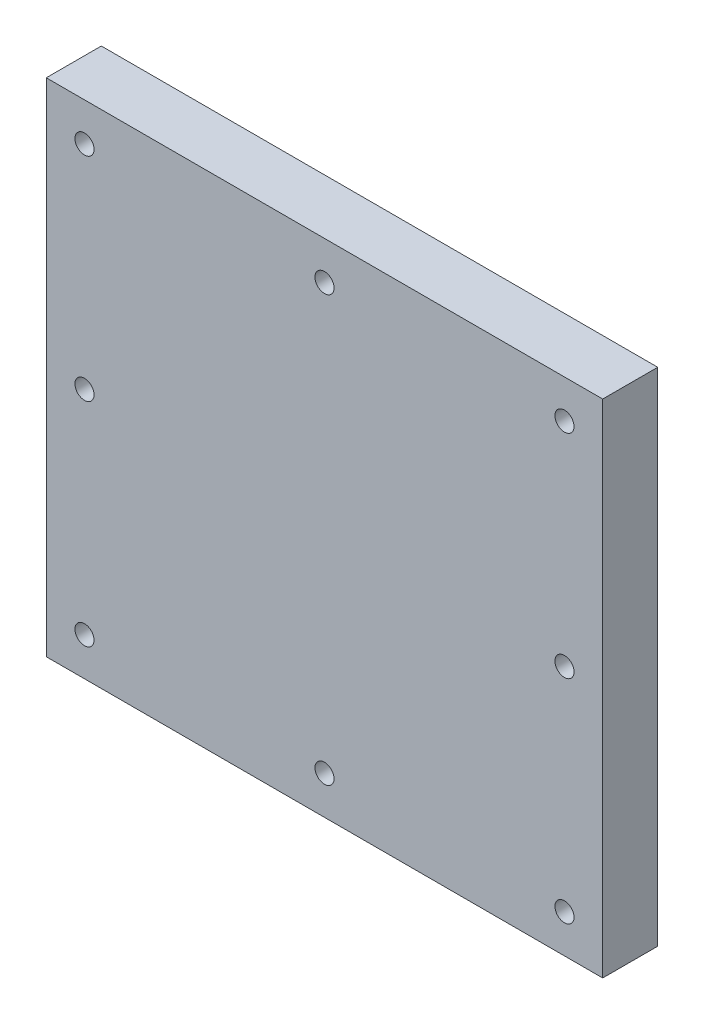
ISO-10303-21;
HEADER;
FILE_DESCRIPTION(('STEP AP214'),'2;1');
FILE_NAME('part.step','',(''),(''),'','','');
FILE_SCHEMA(('AUTOMOTIVE_DESIGN { 1 0 10303 214 1 1 1 1 }'));
ENDSEC;
DATA;
#1=APPLICATION_CONTEXT('core data for automotive mechanical design processes');
#2=APPLICATION_PROTOCOL_DEFINITION('international standard','automotive_design',2000,#1);
#3=PRODUCT_CONTEXT('',#1,'mechanical');
#4=PRODUCT('Part','Part','',(#3));
#5=PRODUCT_RELATED_PRODUCT_CATEGORY('part','',(#4));
#6=PRODUCT_DEFINITION_FORMATION('','',#4);
#7=PRODUCT_DEFINITION_CONTEXT('part definition',#1,'design');
#8=PRODUCT_DEFINITION('design','',#6,#7);
#9=PRODUCT_DEFINITION_SHAPE('','',#8);
#10=(LENGTH_UNIT() NAMED_UNIT(*) SI_UNIT(.MILLI.,.METRE.));
#11=(NAMED_UNIT(*) PLANE_ANGLE_UNIT() SI_UNIT($,.RADIAN.));
#12=(NAMED_UNIT(*) SI_UNIT($,.STERADIAN.) SOLID_ANGLE_UNIT());
#13=UNCERTAINTY_MEASURE_WITH_UNIT(LENGTH_MEASURE(1.E-05),#10,'distance_accuracy_value','');
#14=(GEOMETRIC_REPRESENTATION_CONTEXT(3) GLOBAL_UNCERTAINTY_ASSIGNED_CONTEXT((#13)) GLOBAL_UNIT_ASSIGNED_CONTEXT((#10,
#11,#12)) REPRESENTATION_CONTEXT('',''));
#15=CARTESIAN_POINT('',(0.,0.,0.));
#16=DIRECTION('',(0.,0.,1.));
#17=DIRECTION('',(1.,0.,0.));
#18=AXIS2_PLACEMENT_3D('',#15,#16,#17);
#19=CARTESIAN_POINT('',(254.644886227545,234.22754491018,18.288));
#20=DIRECTION('',(1.,0.,0.));
#21=DIRECTION('',(0.,0.,-1.));
#22=AXIS2_PLACEMENT_3D('',#19,#20,#21);
#23=PLANE('',#22);
#24=DIRECTION('',(0.,-1.,0.));
#25=VECTOR('',#24,1.);
#26=CARTESIAN_POINT('',(254.644886227545,234.22754491018,0.));
#27=LINE('',#26,#25);
#28=CARTESIAN_POINT('',(254.644886227545,234.22754491018,0.));
#29=VERTEX_POINT('',#28);
#30=CARTESIAN_POINT('',(254.644886227545,67.6035449101796,0.));
#31=VERTEX_POINT('',#30);
#32=EDGE_CURVE('E110',#29,#31,#27,.T.);
#33=ORIENTED_EDGE('',*,*,#32,.T.);
#34=DIRECTION('',(0.,0.,-1.));
#35=VECTOR('',#34,1.);
#36=CARTESIAN_POINT('',(254.644886227545,67.6035449101796,18.288));
#37=LINE('',#36,#35);
#38=CARTESIAN_POINT('',(254.644886227545,67.6035449101796,18.288));
#39=VERTEX_POINT('',#38);
#40=EDGE_CURVE('E11',#39,#31,#37,.T.);
#41=ORIENTED_EDGE('',*,*,#40,.F.);
#42=DIRECTION('',(0.,-1.,0.));
#43=VECTOR('',#42,1.);
#44=CARTESIAN_POINT('',(254.644886227545,234.22754491018,18.288));
#45=LINE('',#44,#43);
#46=CARTESIAN_POINT('',(254.644886227545,234.22754491018,18.288));
#47=VERTEX_POINT('',#46);
#48=EDGE_CURVE('E93',#47,#39,#45,.T.);
#49=ORIENTED_EDGE('',*,*,#48,.F.);
#50=DIRECTION('',(0.,0.,-1.));
#51=VECTOR('',#50,1.);
#52=CARTESIAN_POINT('',(254.644886227545,234.22754491018,18.288));
#53=LINE('',#52,#51);
#54=EDGE_CURVE('E106',#47,#29,#53,.T.);
#55=ORIENTED_EDGE('',*,*,#54,.T.);
#56=EDGE_LOOP('',(#33,#41,#49,#55));
#57=FACE_BOUND('',#56,.T.);
#58=ADVANCED_FACE('F39',(#57),#23,.F.);
#59=CARTESIAN_POINT('',(254.644886227545,67.6035449101796,18.288));
#60=DIRECTION('',(0.,1.,0.));
#61=DIRECTION('',(0.,0.,1.));
#62=AXIS2_PLACEMENT_3D('',#59,#60,#61);
#63=PLANE('',#62);
#64=DIRECTION('',(1.,0.,0.));
#65=VECTOR('',#64,1.);
#66=CARTESIAN_POINT('',(254.644886227545,67.6035449101796,0.));
#67=LINE('',#66,#65);
#68=CARTESIAN_POINT('',(439.556886227545,67.6035449101796,0.));
#69=VERTEX_POINT('',#68);
#70=EDGE_CURVE('E98',#31,#69,#67,.T.);
#71=ORIENTED_EDGE('',*,*,#70,.T.);
#72=DIRECTION('',(0.,0.,-1.));
#73=VECTOR('',#72,1.);
#74=CARTESIAN_POINT('',(439.556886227545,67.6035449101796,18.288));
#75=LINE('',#74,#73);
#76=CARTESIAN_POINT('',(439.556886227545,67.6035449101796,18.288));
#77=VERTEX_POINT('',#76);
#78=EDGE_CURVE('E49',#77,#69,#75,.T.);
#79=ORIENTED_EDGE('',*,*,#78,.F.);
#80=DIRECTION('',(1.,0.,0.));
#81=VECTOR('',#80,1.);
#82=CARTESIAN_POINT('',(254.644886227545,67.6035449101796,18.288));
#83=LINE('',#82,#81);
#84=EDGE_CURVE('E88',#39,#77,#83,.T.);
#85=ORIENTED_EDGE('',*,*,#84,.F.);
#86=ORIENTED_EDGE('',*,*,#40,.T.);
#87=EDGE_LOOP('',(#71,#79,#85,#86));
#88=FACE_BOUND('',#87,.T.);
#89=ADVANCED_FACE('F97',(#88),#63,.F.);
#90=CARTESIAN_POINT('',(439.556886227545,234.22754491018,18.288));
#91=DIRECTION('',(-1.,0.,0.));
#92=DIRECTION('',(0.,-1.,0.));
#93=AXIS2_PLACEMENT_3D('',#90,#91,#92);
#94=PLANE('',#93);
#95=DIRECTION('',(0.,1.,0.));
#96=VECTOR('',#95,1.);
#97=CARTESIAN_POINT('',(439.556886227545,234.22754491018,0.));
#98=LINE('',#97,#96);
#99=CARTESIAN_POINT('',(439.556886227545,234.22754491018,0.));
#100=VERTEX_POINT('',#99);
#101=EDGE_CURVE('E75',#69,#100,#98,.T.);
#102=ORIENTED_EDGE('',*,*,#101,.T.);
#103=DIRECTION('',(0.,0.,-1.));
#104=VECTOR('',#103,1.);
#105=CARTESIAN_POINT('',(439.556886227545,234.22754491018,18.288));
#106=LINE('',#105,#104);
#107=CARTESIAN_POINT('',(439.556886227545,234.22754491018,18.288));
#108=VERTEX_POINT('',#107);
#109=EDGE_CURVE('E100',#108,#100,#106,.T.);
#110=ORIENTED_EDGE('',*,*,#109,.F.);
#111=DIRECTION('',(0.,1.,0.));
#112=VECTOR('',#111,1.);
#113=CARTESIAN_POINT('',(439.556886227545,234.22754491018,18.288));
#114=LINE('',#113,#112);
#115=EDGE_CURVE('E91',#77,#108,#114,.T.);
#116=ORIENTED_EDGE('',*,*,#115,.F.);
#117=ORIENTED_EDGE('',*,*,#78,.T.);
#118=EDGE_LOOP('',(#102,#110,#116,#117));
#119=FACE_BOUND('',#118,.T.);
#120=ADVANCED_FACE('F102',(#119),#94,.F.);
#121=CARTESIAN_POINT('',(254.644886227545,234.22754491018,18.288));
#122=DIRECTION('',(0.,-1.,0.));
#123=DIRECTION('',(0.,0.,-1.));
#124=AXIS2_PLACEMENT_3D('',#121,#122,#123);
#125=PLANE('',#124);
#126=DIRECTION('',(-1.,0.,0.));
#127=VECTOR('',#126,1.);
#128=CARTESIAN_POINT('',(254.644886227545,234.22754491018,0.));
#129=LINE('',#128,#127);
#130=EDGE_CURVE('E81',#100,#29,#129,.T.);
#131=ORIENTED_EDGE('',*,*,#130,.T.);
#132=ORIENTED_EDGE('',*,*,#54,.F.);
#133=DIRECTION('',(-1.,0.,0.));
#134=VECTOR('',#133,1.);
#135=CARTESIAN_POINT('',(254.644886227545,234.22754491018,18.288));
#136=LINE('',#135,#134);
#137=EDGE_CURVE('E58',#108,#47,#136,.T.);
#138=ORIENTED_EDGE('',*,*,#137,.F.);
#139=ORIENTED_EDGE('',*,*,#109,.T.);
#140=EDGE_LOOP('',(#131,#132,#138,#139));
#141=FACE_BOUND('',#140,.T.);
#142=ADVANCED_FACE('F188',(#141),#125,.F.);
#143=CARTESIAN_POINT('',(0.,0.,18.288));
#144=DIRECTION('',(0.,0.,1.));
#145=DIRECTION('',(1.,0.,0.));
#146=AXIS2_PLACEMENT_3D('',#143,#144,#145);
#147=PLANE('',#146);
#148=CARTESIAN_POINT('',(426.856886227545,80.3035449101796,18.288));
#149=DIRECTION('',(0.,0.,1.));
#150=DIRECTION('',(1.,0.,0.));
#151=AXIS2_PLACEMENT_3D('',#148,#149,#150);
#152=CIRCLE('',#151,3.17499999999997);
#153=CARTESIAN_POINT('',(430.031886227545,80.3035449101796,18.288));
#154=VERTEX_POINT('',#153);
#155=EDGE_CURVE('E311',#154,#154,#152,.T.);
#156=ORIENTED_EDGE('',*,*,#155,.F.);
#157=EDGE_LOOP('',(#156));
#158=FACE_BOUND('',#157,.T.);
#159=CARTESIAN_POINT('',(347.100886227545,80.3035449101796,18.288));
#160=DIRECTION('',(0.,0.,1.));
#161=DIRECTION('',(1.,0.,0.));
#162=AXIS2_PLACEMENT_3D('',#159,#160,#161);
#163=CIRCLE('',#162,3.17499999999997);
#164=CARTESIAN_POINT('',(350.275886227545,80.3035449101796,18.288));
#165=VERTEX_POINT('',#164);
#166=EDGE_CURVE('E303',#165,#165,#163,.T.);
#167=ORIENTED_EDGE('',*,*,#166,.F.);
#168=EDGE_LOOP('',(#167));
#169=FACE_BOUND('',#168,.T.);
#170=CARTESIAN_POINT('',(267.344886227545,80.3035449101796,18.288));
#171=DIRECTION('',(0.,0.,1.));
#172=DIRECTION('',(1.,0.,0.));
#173=AXIS2_PLACEMENT_3D('',#170,#171,#172);
#174=CIRCLE('',#173,3.17499999999997);
#175=CARTESIAN_POINT('',(270.519886227545,80.3035449101796,18.288));
#176=VERTEX_POINT('',#175);
#177=EDGE_CURVE('E282',#176,#176,#174,.T.);
#178=ORIENTED_EDGE('',*,*,#177,.F.);
#179=EDGE_LOOP('',(#178));
#180=FACE_BOUND('',#179,.T.);
#181=CARTESIAN_POINT('',(267.344886227545,150.91554491018,18.288));
#182=DIRECTION('',(0.,0.,1.));
#183=DIRECTION('',(1.,0.,0.));
#184=AXIS2_PLACEMENT_3D('',#181,#182,#183);
#185=CIRCLE('',#184,3.17499999999997);
#186=CARTESIAN_POINT('',(270.519886227545,150.91554491018,18.288));
#187=VERTEX_POINT('',#186);
#188=EDGE_CURVE('E302',#187,#187,#185,.T.);
#189=ORIENTED_EDGE('',*,*,#188,.F.);
#190=EDGE_LOOP('',(#189));
#191=FACE_BOUND('',#190,.T.);
#192=CARTESIAN_POINT('',(426.856886227545,150.91554491018,18.288));
#193=DIRECTION('',(0.,0.,1.));
#194=DIRECTION('',(1.,0.,0.));
#195=AXIS2_PLACEMENT_3D('',#192,#193,#194);
#196=CIRCLE('',#195,3.17499999999997);
#197=CARTESIAN_POINT('',(430.031886227545,150.91554491018,18.288));
#198=VERTEX_POINT('',#197);
#199=EDGE_CURVE('E308',#198,#198,#196,.T.);
#200=ORIENTED_EDGE('',*,*,#199,.F.);
#201=EDGE_LOOP('',(#200));
#202=FACE_BOUND('',#201,.T.);
#203=CARTESIAN_POINT('',(426.856886227545,221.52754491018,18.288));
#204=DIRECTION('',(0.,0.,1.));
#205=DIRECTION('',(1.,0.,0.));
#206=AXIS2_PLACEMENT_3D('',#203,#204,#205);
#207=CIRCLE('',#206,3.17499999999997);
#208=CARTESIAN_POINT('',(430.031886227545,221.52754491018,18.288));
#209=VERTEX_POINT('',#208);
#210=EDGE_CURVE('E324',#209,#209,#207,.T.);
#211=ORIENTED_EDGE('',*,*,#210,.F.);
#212=EDGE_LOOP('',(#211));
#213=FACE_BOUND('',#212,.T.);
#214=CARTESIAN_POINT('',(347.100886227545,221.52754491018,18.288));
#215=DIRECTION('',(0.,0.,1.));
#216=DIRECTION('',(1.,0.,0.));
#217=AXIS2_PLACEMENT_3D('',#214,#215,#216);
#218=CIRCLE('',#217,3.17499999999997);
#219=CARTESIAN_POINT('',(350.275886227545,221.52754491018,18.288));
#220=VERTEX_POINT('',#219);
#221=EDGE_CURVE('E319',#220,#220,#218,.T.);
#222=ORIENTED_EDGE('',*,*,#221,.F.);
#223=EDGE_LOOP('',(#222));
#224=FACE_BOUND('',#223,.T.);
#225=CARTESIAN_POINT('',(267.344886227545,221.52754491018,18.288));
#226=DIRECTION('',(0.,0.,1.));
#227=DIRECTION('',(1.,0.,0.));
#228=AXIS2_PLACEMENT_3D('',#225,#226,#227);
#229=CIRCLE('',#228,3.17499999999997);
#230=CARTESIAN_POINT('',(270.519886227545,221.52754491018,18.288));
#231=VERTEX_POINT('',#230);
#232=EDGE_CURVE('E129',#231,#231,#229,.T.);
#233=ORIENTED_EDGE('',*,*,#232,.F.);
#234=EDGE_LOOP('',(#233));
#235=FACE_BOUND('',#234,.T.);
#236=ORIENTED_EDGE('',*,*,#48,.T.);
#237=ORIENTED_EDGE('',*,*,#84,.T.);
#238=ORIENTED_EDGE('',*,*,#115,.T.);
#239=ORIENTED_EDGE('',*,*,#137,.T.);
#240=EDGE_LOOP('',(#236,#237,#238,#239));
#241=FACE_BOUND('',#240,.T.);
#242=ADVANCED_FACE('F89',(#158,#169,#180,#191,#202,#213,#224,#235,#241),#147,.T.);
#243=CARTESIAN_POINT('',(0.,0.,0.));
#244=DIRECTION('',(0.,0.,1.));
#245=DIRECTION('',(1.,0.,0.));
#246=AXIS2_PLACEMENT_3D('',#243,#244,#245);
#247=PLANE('',#246);
#248=CARTESIAN_POINT('',(426.856886227545,80.3035449101796,0.));
#249=DIRECTION('',(0.,0.,1.));
#250=DIRECTION('',(1.,0.,0.));
#251=AXIS2_PLACEMENT_3D('',#248,#249,#250);
#252=CIRCLE('',#251,3.17499999999997);
#253=CARTESIAN_POINT('',(430.031886227545,80.3035449101796,0.));
#254=VERTEX_POINT('',#253);
#255=EDGE_CURVE('E42',#254,#254,#252,.T.);
#256=ORIENTED_EDGE('',*,*,#255,.T.);
#257=EDGE_LOOP('',(#256));
#258=FACE_BOUND('',#257,.T.);
#259=CARTESIAN_POINT('',(347.100886227545,80.3035449101796,0.));
#260=DIRECTION('',(0.,0.,1.));
#261=DIRECTION('',(1.,0.,0.));
#262=AXIS2_PLACEMENT_3D('',#259,#260,#261);
#263=CIRCLE('',#262,3.17499999999997);
#264=CARTESIAN_POINT('',(350.275886227545,80.3035449101796,0.));
#265=VERTEX_POINT('',#264);
#266=EDGE_CURVE('E148',#265,#265,#263,.T.);
#267=ORIENTED_EDGE('',*,*,#266,.T.);
#268=EDGE_LOOP('',(#267));
#269=FACE_BOUND('',#268,.T.);
#270=CARTESIAN_POINT('',(267.344886227545,80.3035449101796,0.));
#271=DIRECTION('',(0.,0.,1.));
#272=DIRECTION('',(1.,0.,0.));
#273=AXIS2_PLACEMENT_3D('',#270,#271,#272);
#274=CIRCLE('',#273,3.17499999999997);
#275=CARTESIAN_POINT('',(270.519886227545,80.3035449101796,0.));
#276=VERTEX_POINT('',#275);
#277=EDGE_CURVE('E145',#276,#276,#274,.T.);
#278=ORIENTED_EDGE('',*,*,#277,.T.);
#279=EDGE_LOOP('',(#278));
#280=FACE_BOUND('',#279,.T.);
#281=CARTESIAN_POINT('',(267.344886227545,150.91554491018,0.));
#282=DIRECTION('',(0.,0.,1.));
#283=DIRECTION('',(1.,0.,0.));
#284=AXIS2_PLACEMENT_3D('',#281,#282,#283);
#285=CIRCLE('',#284,3.17499999999997);
#286=CARTESIAN_POINT('',(270.519886227545,150.91554491018,0.));
#287=VERTEX_POINT('',#286);
#288=EDGE_CURVE('E141',#287,#287,#285,.T.);
#289=ORIENTED_EDGE('',*,*,#288,.T.);
#290=EDGE_LOOP('',(#289));
#291=FACE_BOUND('',#290,.T.);
#292=CARTESIAN_POINT('',(426.856886227545,150.91554491018,0.));
#293=DIRECTION('',(0.,0.,1.));
#294=DIRECTION('',(1.,0.,0.));
#295=AXIS2_PLACEMENT_3D('',#292,#293,#294);
#296=CIRCLE('',#295,3.17499999999997);
#297=CARTESIAN_POINT('',(430.031886227545,150.91554491018,0.));
#298=VERTEX_POINT('',#297);
#299=EDGE_CURVE('E137',#298,#298,#296,.T.);
#300=ORIENTED_EDGE('',*,*,#299,.T.);
#301=EDGE_LOOP('',(#300));
#302=FACE_BOUND('',#301,.T.);
#303=CARTESIAN_POINT('',(426.856886227545,221.52754491018,0.));
#304=DIRECTION('',(0.,0.,1.));
#305=DIRECTION('',(1.,0.,0.));
#306=AXIS2_PLACEMENT_3D('',#303,#304,#305);
#307=CIRCLE('',#306,3.17499999999997);
#308=CARTESIAN_POINT('',(430.031886227545,221.52754491018,0.));
#309=VERTEX_POINT('',#308);
#310=EDGE_CURVE('E133',#309,#309,#307,.T.);
#311=ORIENTED_EDGE('',*,*,#310,.T.);
#312=EDGE_LOOP('',(#311));
#313=FACE_BOUND('',#312,.T.);
#314=CARTESIAN_POINT('',(347.100886227545,221.52754491018,0.));
#315=DIRECTION('',(0.,0.,1.));
#316=DIRECTION('',(1.,0.,0.));
#317=AXIS2_PLACEMENT_3D('',#314,#315,#316);
#318=CIRCLE('',#317,3.17499999999997);
#319=CARTESIAN_POINT('',(350.275886227545,221.52754491018,0.));
#320=VERTEX_POINT('',#319);
#321=EDGE_CURVE('E128',#320,#320,#318,.T.);
#322=ORIENTED_EDGE('',*,*,#321,.T.);
#323=EDGE_LOOP('',(#322));
#324=FACE_BOUND('',#323,.T.);
#325=CARTESIAN_POINT('',(267.344886227545,221.52754491018,0.));
#326=DIRECTION('',(0.,0.,1.));
#327=DIRECTION('',(1.,0.,0.));
#328=AXIS2_PLACEMENT_3D('',#325,#326,#327);
#329=CIRCLE('',#328,3.17499999999997);
#330=CARTESIAN_POINT('',(270.519886227545,221.52754491018,0.));
#331=VERTEX_POINT('',#330);
#332=EDGE_CURVE('E124',#331,#331,#329,.T.);
#333=ORIENTED_EDGE('',*,*,#332,.T.);
#334=EDGE_LOOP('',(#333));
#335=FACE_BOUND('',#334,.T.);
#336=ORIENTED_EDGE('',*,*,#32,.F.);
#337=ORIENTED_EDGE('',*,*,#130,.F.);
#338=ORIENTED_EDGE('',*,*,#101,.F.);
#339=ORIENTED_EDGE('',*,*,#70,.F.);
#340=EDGE_LOOP('',(#336,#337,#338,#339));
#341=FACE_BOUND('',#340,.T.);
#342=ADVANCED_FACE('F157',(#258,#269,#280,#291,#302,#313,#324,#335,#341),#247,.F.);
#343=CARTESIAN_POINT('',(267.344886227545,221.52754491018,-7.112));
#344=DIRECTION('',(0.,0.,1.));
#345=DIRECTION('',(1.,0.,0.));
#346=AXIS2_PLACEMENT_3D('',#343,#344,#345);
#347=CYLINDRICAL_SURFACE('',#346,3.17499999999997);
#348=ORIENTED_EDGE('',*,*,#232,.T.);
#349=EDGE_LOOP('',(#348));
#350=FACE_BOUND('',#349,.T.);
#351=ORIENTED_EDGE('',*,*,#332,.F.);
#352=EDGE_LOOP('',(#351));
#353=FACE_BOUND('',#352,.T.);
#354=ADVANCED_FACE('F180',(#350,#353),#347,.F.);
#355=CARTESIAN_POINT('',(347.100886227545,221.52754491018,-7.112));
#356=DIRECTION('',(0.,0.,1.));
#357=DIRECTION('',(1.,0.,0.));
#358=AXIS2_PLACEMENT_3D('',#355,#356,#357);
#359=CYLINDRICAL_SURFACE('',#358,3.17499999999997);
#360=ORIENTED_EDGE('',*,*,#221,.T.);
#361=EDGE_LOOP('',(#360));
#362=FACE_BOUND('',#361,.T.);
#363=ORIENTED_EDGE('',*,*,#321,.F.);
#364=EDGE_LOOP('',(#363));
#365=FACE_BOUND('',#364,.T.);
#366=ADVANCED_FACE('F186',(#362,#365),#359,.F.);
#367=CARTESIAN_POINT('',(426.856886227545,221.52754491018,-7.112));
#368=DIRECTION('',(0.,0.,1.));
#369=DIRECTION('',(1.,0.,0.));
#370=AXIS2_PLACEMENT_3D('',#367,#368,#369);
#371=CYLINDRICAL_SURFACE('',#370,3.17499999999997);
#372=ORIENTED_EDGE('',*,*,#210,.T.);
#373=EDGE_LOOP('',(#372));
#374=FACE_BOUND('',#373,.T.);
#375=ORIENTED_EDGE('',*,*,#310,.F.);
#376=EDGE_LOOP('',(#375));
#377=FACE_BOUND('',#376,.T.);
#378=ADVANCED_FACE('F226',(#374,#377),#371,.F.);
#379=CARTESIAN_POINT('',(426.856886227545,150.91554491018,-7.112));
#380=DIRECTION('',(0.,0.,1.));
#381=DIRECTION('',(1.,0.,0.));
#382=AXIS2_PLACEMENT_3D('',#379,#380,#381);
#383=CYLINDRICAL_SURFACE('',#382,3.17499999999997);
#384=ORIENTED_EDGE('',*,*,#199,.T.);
#385=EDGE_LOOP('',(#384));
#386=FACE_BOUND('',#385,.T.);
#387=ORIENTED_EDGE('',*,*,#299,.F.);
#388=EDGE_LOOP('',(#387));
#389=FACE_BOUND('',#388,.T.);
#390=ADVANCED_FACE('F236',(#386,#389),#383,.F.);
#391=CARTESIAN_POINT('',(267.344886227545,150.91554491018,-7.112));
#392=DIRECTION('',(0.,0.,1.));
#393=DIRECTION('',(1.,0.,0.));
#394=AXIS2_PLACEMENT_3D('',#391,#392,#393);
#395=CYLINDRICAL_SURFACE('',#394,3.17499999999997);
#396=ORIENTED_EDGE('',*,*,#188,.T.);
#397=EDGE_LOOP('',(#396));
#398=FACE_BOUND('',#397,.T.);
#399=ORIENTED_EDGE('',*,*,#288,.F.);
#400=EDGE_LOOP('',(#399));
#401=FACE_BOUND('',#400,.T.);
#402=ADVANCED_FACE('F246',(#398,#401),#395,.F.);
#403=CARTESIAN_POINT('',(267.344886227545,80.3035449101796,-7.112));
#404=DIRECTION('',(0.,0.,1.));
#405=DIRECTION('',(1.,0.,0.));
#406=AXIS2_PLACEMENT_3D('',#403,#404,#405);
#407=CYLINDRICAL_SURFACE('',#406,3.17499999999997);
#408=ORIENTED_EDGE('',*,*,#177,.T.);
#409=EDGE_LOOP('',(#408));
#410=FACE_BOUND('',#409,.T.);
#411=ORIENTED_EDGE('',*,*,#277,.F.);
#412=EDGE_LOOP('',(#411));
#413=FACE_BOUND('',#412,.T.);
#414=ADVANCED_FACE('F167',(#410,#413),#407,.F.);
#415=CARTESIAN_POINT('',(347.100886227545,80.3035449101796,-7.112));
#416=DIRECTION('',(0.,0.,1.));
#417=DIRECTION('',(1.,0.,0.));
#418=AXIS2_PLACEMENT_3D('',#415,#416,#417);
#419=CYLINDRICAL_SURFACE('',#418,3.17499999999997);
#420=ORIENTED_EDGE('',*,*,#166,.T.);
#421=EDGE_LOOP('',(#420));
#422=FACE_BOUND('',#421,.T.);
#423=ORIENTED_EDGE('',*,*,#266,.F.);
#424=EDGE_LOOP('',(#423));
#425=FACE_BOUND('',#424,.T.);
#426=ADVANCED_FACE('F161',(#422,#425),#419,.F.);
#427=CARTESIAN_POINT('',(426.856886227545,80.3035449101796,-7.112));
#428=DIRECTION('',(0.,0.,1.));
#429=DIRECTION('',(1.,0.,0.));
#430=AXIS2_PLACEMENT_3D('',#427,#428,#429);
#431=CYLINDRICAL_SURFACE('',#430,3.17499999999997);
#432=ORIENTED_EDGE('',*,*,#155,.T.);
#433=EDGE_LOOP('',(#432));
#434=FACE_BOUND('',#433,.T.);
#435=ORIENTED_EDGE('',*,*,#255,.F.);
#436=EDGE_LOOP('',(#435));
#437=FACE_BOUND('',#436,.T.);
#438=ADVANCED_FACE('F159',(#434,#437),#431,.F.);
#439=CLOSED_SHELL('',(#58,#89,#120,#142,#242,#342,#354,#366,#378,#390,#402,#414,#426,#438));
#440=MANIFOLD_SOLID_BREP('B2',#439);
#441=ADVANCED_BREP_SHAPE_REPRESENTATION('',(#18,#440),#14);
#442=SHAPE_DEFINITION_REPRESENTATION(#9,#441);
ENDSEC;
END-ISO-10303-21;
